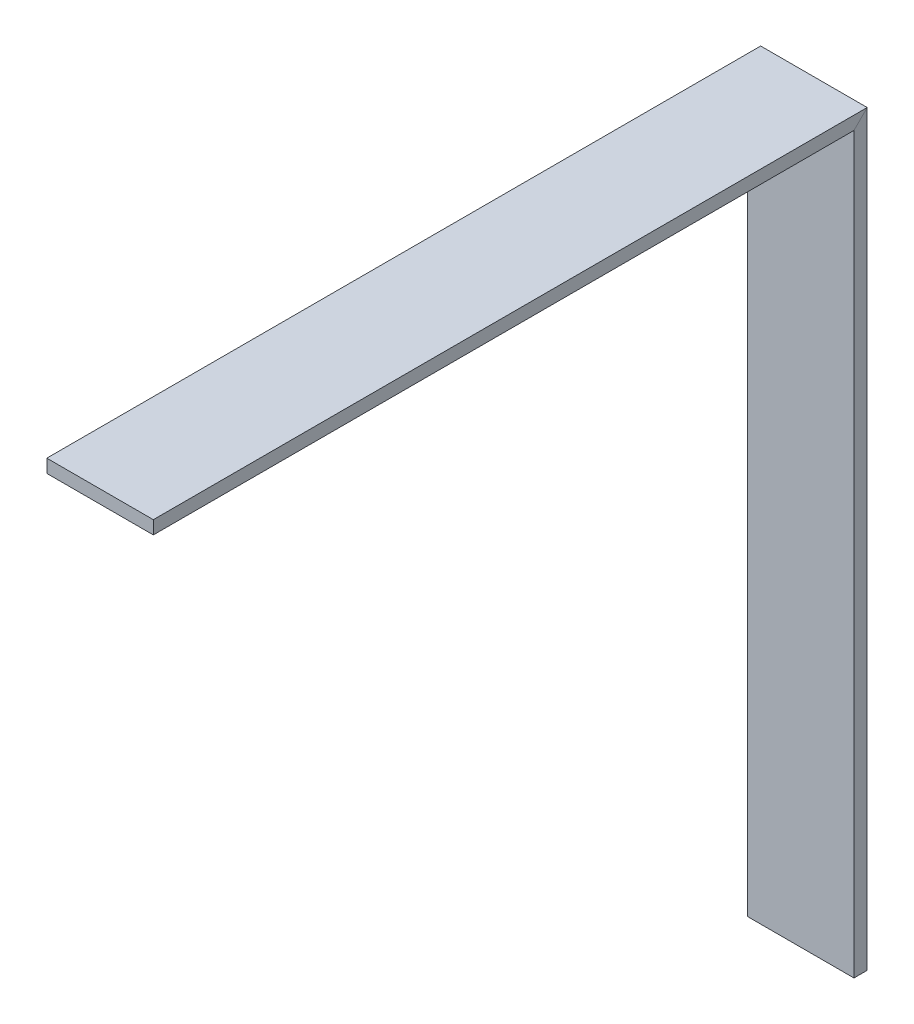
ISO-10303-21;
HEADER;
FILE_DESCRIPTION(('STEP AP214'),'2;1');
FILE_NAME('part.step','',(''),(''),'','','');
FILE_SCHEMA(('AUTOMOTIVE_DESIGN { 1 0 10303 214 1 1 1 1 }'));
ENDSEC;
DATA;
#1=APPLICATION_CONTEXT('core data for automotive mechanical design processes');
#2=APPLICATION_PROTOCOL_DEFINITION('international standard','automotive_design',2000,#1);
#3=PRODUCT_CONTEXT('',#1,'mechanical');
#4=PRODUCT('Part','Part','',(#3));
#5=PRODUCT_RELATED_PRODUCT_CATEGORY('part','',(#4));
#6=PRODUCT_DEFINITION_FORMATION('','',#4);
#7=PRODUCT_DEFINITION_CONTEXT('part definition',#1,'design');
#8=PRODUCT_DEFINITION('design','',#6,#7);
#9=PRODUCT_DEFINITION_SHAPE('','',#8);
#10=(LENGTH_UNIT() NAMED_UNIT(*) SI_UNIT(.MILLI.,.METRE.));
#11=(NAMED_UNIT(*) PLANE_ANGLE_UNIT() SI_UNIT($,.RADIAN.));
#12=(NAMED_UNIT(*) SI_UNIT($,.STERADIAN.) SOLID_ANGLE_UNIT());
#13=UNCERTAINTY_MEASURE_WITH_UNIT(LENGTH_MEASURE(1.E-05),#10,'distance_accuracy_value','');
#14=(GEOMETRIC_REPRESENTATION_CONTEXT(3) GLOBAL_UNCERTAINTY_ASSIGNED_CONTEXT((#13)) GLOBAL_UNIT_ASSIGNED_CONTEXT((#10,
#11,#12)) REPRESENTATION_CONTEXT('',''));
#15=CARTESIAN_POINT('',(0.,0.,0.));
#16=DIRECTION('',(0.,0.,1.));
#17=DIRECTION('',(1.,0.,0.));
#18=AXIS2_PLACEMENT_3D('',#15,#16,#17);
#19=CARTESIAN_POINT('',(25.4,3.155,574.));
#20=DIRECTION('',(-1.,0.,0.));
#21=DIRECTION('',(0.,0.,1.));
#22=AXIS2_PLACEMENT_3D('',#19,#20,#21);
#23=PLANE('',#22);
#24=DIRECTION('',(0.,1.,0.));
#25=VECTOR('',#24,1.);
#26=CARTESIAN_POINT('',(25.4,-278.803420764741,6.3139762721911));
#27=LINE('',#26,#25);
#28=CARTESIAN_POINT('',(25.4,-204.04792076474,6.3139762721911));
#29=VERTEX_POINT('',#28);
#30=CARTESIAN_POINT('',(25.4,145.95207923526,6.31397627219112));
#31=VERTEX_POINT('',#30);
#32=EDGE_CURVE('E86',#29,#31,#27,.T.);
#33=ORIENTED_EDGE('',*,*,#32,.F.);
#34=DIRECTION('',(0.,0.,1.));
#35=VECTOR('',#34,1.);
#36=CARTESIAN_POINT('',(25.4,-204.04792076474,6.31138435162644));
#37=LINE('',#36,#35);
#38=CARTESIAN_POINT('',(25.4,-204.04792076474,0.00397627219100947));
#39=VERTEX_POINT('',#38);
#40=EDGE_CURVE('E49',#39,#29,#37,.T.);
#41=ORIENTED_EDGE('',*,*,#40,.F.);
#42=DIRECTION('',(0.,1.,0.));
#43=VECTOR('',#42,1.);
#44=CARTESIAN_POINT('',(25.4,-278.803420764741,0.0039762721910086));
#45=LINE('',#44,#43);
#46=CARTESIAN_POINT('',(25.4,152.26207923526,0.0039762721910355));
#47=VERTEX_POINT('',#46);
#48=EDGE_CURVE('E104',#39,#47,#45,.T.);
#49=ORIENTED_EDGE('',*,*,#48,.T.);
#50=DIRECTION('',(0.,0.707106781186548,-0.707106781186548));
#51=VECTOR('',#50,1.);
#52=CARTESIAN_POINT('',(25.4,-63.2706707647403,215.536726272191));
#53=LINE('',#52,#51);
#54=EDGE_CURVE('E110',#31,#47,#53,.T.);
#55=ORIENTED_EDGE('',*,*,#54,.F.);
#56=EDGE_LOOP('',(#33,#41,#49,#55));
#57=FACE_BOUND('',#56,.T.);
#58=ADVANCED_FACE('F35',(#57),#23,.F.);
#59=CARTESIAN_POINT('',(-25.4,3.155,574.));
#60=DIRECTION('',(1.,0.,0.));
#61=DIRECTION('',(0.,0.,-1.));
#62=AXIS2_PLACEMENT_3D('',#59,#60,#61);
#63=PLANE('',#62);
#64=DIRECTION('',(0.,1.,0.));
#65=VECTOR('',#64,1.);
#66=CARTESIAN_POINT('',(-25.4,-278.803420764741,0.0039762721910086));
#67=LINE('',#66,#65);
#68=CARTESIAN_POINT('',(-25.4,-204.04792076474,0.00397627219106411));
#69=VERTEX_POINT('',#68);
#70=CARTESIAN_POINT('',(-25.4,152.26207923526,0.0039762721910355));
#71=VERTEX_POINT('',#70);
#72=EDGE_CURVE('E115',#69,#71,#67,.T.);
#73=ORIENTED_EDGE('',*,*,#72,.F.);
#74=DIRECTION('',(0.,0.,1.));
#75=VECTOR('',#74,1.);
#76=CARTESIAN_POINT('',(-25.4,-204.04792076474,574.));
#77=LINE('',#76,#75);
#78=CARTESIAN_POINT('',(-25.4,-204.04792076474,6.31397627219099));
#79=VERTEX_POINT('',#78);
#80=EDGE_CURVE('E98',#69,#79,#77,.T.);
#81=ORIENTED_EDGE('',*,*,#80,.T.);
#82=DIRECTION('',(0.,1.,0.));
#83=VECTOR('',#82,1.);
#84=CARTESIAN_POINT('',(-25.4,-278.803420764741,6.31397627219099));
#85=LINE('',#84,#83);
#86=CARTESIAN_POINT('',(-25.4,145.95207923526,6.31397627219103));
#87=VERTEX_POINT('',#86);
#88=EDGE_CURVE('E57',#79,#87,#85,.T.);
#89=ORIENTED_EDGE('',*,*,#88,.T.);
#90=DIRECTION('',(0.,-0.707106781186548,0.707106781186548));
#91=VECTOR('',#90,1.);
#92=CARTESIAN_POINT('',(-25.4,-63.2706707647403,215.536726272191));
#93=LINE('',#92,#91);
#94=EDGE_CURVE('E141',#71,#87,#93,.T.);
#95=ORIENTED_EDGE('',*,*,#94,.F.);
#96=EDGE_LOOP('',(#73,#81,#89,#95));
#97=FACE_BOUND('',#96,.T.);
#98=ADVANCED_FACE('F143',(#97),#63,.F.);
#99=CARTESIAN_POINT('',(-25.4,-278.803420764741,0.0039762721910086));
#100=DIRECTION('',(0.,0.,1.));
#101=DIRECTION('',(1.,0.,0.));
#102=AXIS2_PLACEMENT_3D('',#99,#100,#101);
#103=PLANE('',#102);
#104=ORIENTED_EDGE('',*,*,#48,.F.);
#105=DIRECTION('',(-1.,0.,0.));
#106=VECTOR('',#105,1.);
#107=CARTESIAN_POINT('',(-25.4,-204.04792076474,0.0039762721910086));
#108=LINE('',#107,#106);
#109=EDGE_CURVE('E96',#39,#69,#108,.T.);
#110=ORIENTED_EDGE('',*,*,#109,.T.);
#111=ORIENTED_EDGE('',*,*,#72,.T.);
#112=DIRECTION('',(-1.,0.,0.));
#113=VECTOR('',#112,1.);
#114=CARTESIAN_POINT('',(-25.4,152.26207923526,0.0039762721910086));
#115=LINE('',#114,#113);
#116=EDGE_CURVE('E109',#47,#71,#115,.T.);
#117=ORIENTED_EDGE('',*,*,#116,.F.);
#118=EDGE_LOOP('',(#104,#110,#111,#117));
#119=FACE_BOUND('',#118,.T.);
#120=ADVANCED_FACE('F107',(#119),#103,.F.);
#121=CARTESIAN_POINT('',(0.,-126.125841529481,340.398976272191));
#122=DIRECTION('',(0.,0.,1.));
#123=DIRECTION('',(-1.,0.,0.));
#124=AXIS2_PLACEMENT_3D('',#121,#122,#123);
#125=PLANE('',#124);
#126=DIRECTION('',(0.,-1.,0.));
#127=VECTOR('',#126,1.);
#128=CARTESIAN_POINT('',(25.4,152.26207923526,340.398976272191));
#129=LINE('',#128,#127);
#130=CARTESIAN_POINT('',(25.4,152.26207923526,340.398976272191));
#131=VERTEX_POINT('',#130);
#132=CARTESIAN_POINT('',(25.4,145.95207923526,340.398976272191));
#133=VERTEX_POINT('',#132);
#134=EDGE_CURVE('E123',#131,#133,#129,.T.);
#135=ORIENTED_EDGE('',*,*,#134,.F.);
#136=DIRECTION('',(1.,0.,0.));
#137=VECTOR('',#136,1.);
#138=CARTESIAN_POINT('',(-25.4,152.26207923526,340.398976272191));
#139=LINE('',#138,#137);
#140=CARTESIAN_POINT('',(-25.4,152.26207923526,340.398976272191));
#141=VERTEX_POINT('',#140);
#142=EDGE_CURVE('E80',#141,#131,#139,.T.);
#143=ORIENTED_EDGE('',*,*,#142,.F.);
#144=DIRECTION('',(0.,1.,0.));
#145=VECTOR('',#144,1.);
#146=CARTESIAN_POINT('',(-25.4,152.26207923526,340.398976272191));
#147=LINE('',#146,#145);
#148=CARTESIAN_POINT('',(-25.4,145.95207923526,340.398976272191));
#149=VERTEX_POINT('',#148);
#150=EDGE_CURVE('E119',#149,#141,#147,.T.);
#151=ORIENTED_EDGE('',*,*,#150,.F.);
#152=DIRECTION('',(-1.,0.,0.));
#153=VECTOR('',#152,1.);
#154=CARTESIAN_POINT('',(-25.4,145.95207923526,340.398976272191));
#155=LINE('',#154,#153);
#156=EDGE_CURVE('E121',#133,#149,#155,.T.);
#157=ORIENTED_EDGE('',*,*,#156,.F.);
#158=EDGE_LOOP('',(#135,#143,#151,#157));
#159=FACE_BOUND('',#158,.T.);
#160=ADVANCED_FACE('F159',(#159),#125,.T.);
#161=CARTESIAN_POINT('',(25.4,152.26207923526,-0.411523727808973));
#162=DIRECTION('',(-1.,0.,0.));
#163=DIRECTION('',(0.,-1.,0.));
#164=AXIS2_PLACEMENT_3D('',#161,#162,#163);
#165=PLANE('',#164);
#166=ORIENTED_EDGE('',*,*,#54,.T.);
#167=DIRECTION('',(0.,0.,1.));
#168=VECTOR('',#167,1.);
#169=CARTESIAN_POINT('',(25.4,152.26207923526,-0.411523727808973));
#170=LINE('',#169,#168);
#171=EDGE_CURVE('E133',#47,#131,#170,.T.);
#172=ORIENTED_EDGE('',*,*,#171,.T.);
#173=ORIENTED_EDGE('',*,*,#134,.T.);
#174=DIRECTION('',(0.,0.,1.));
#175=VECTOR('',#174,1.);
#176=CARTESIAN_POINT('',(25.4,145.95207923526,-0.411523727808972));
#177=LINE('',#176,#175);
#178=EDGE_CURVE('E130',#31,#133,#177,.T.);
#179=ORIENTED_EDGE('',*,*,#178,.F.);
#180=EDGE_LOOP('',(#166,#172,#173,#179));
#181=FACE_BOUND('',#180,.T.);
#182=ADVANCED_FACE('F161',(#181),#165,.F.);
#183=CARTESIAN_POINT('',(-25.4,145.95207923526,-0.411523727808972));
#184=DIRECTION('',(0.,1.,0.));
#185=DIRECTION('',(-1.,0.,0.));
#186=AXIS2_PLACEMENT_3D('',#183,#184,#185);
#187=PLANE('',#186);
#188=DIRECTION('',(1.,0.,0.));
#189=VECTOR('',#188,1.);
#190=CARTESIAN_POINT('',(-25.3999999999991,145.95207923526,6.31397627219099));
#191=LINE('',#190,#189);
#192=EDGE_CURVE('E42',#87,#31,#191,.T.);
#193=ORIENTED_EDGE('',*,*,#192,.T.);
#194=ORIENTED_EDGE('',*,*,#178,.T.);
#195=ORIENTED_EDGE('',*,*,#156,.T.);
#196=DIRECTION('',(0.,0.,1.));
#197=VECTOR('',#196,1.);
#198=CARTESIAN_POINT('',(-25.4,145.95207923526,-0.411523727808972));
#199=LINE('',#198,#197);
#200=EDGE_CURVE('E127',#87,#149,#199,.T.);
#201=ORIENTED_EDGE('',*,*,#200,.F.);
#202=EDGE_LOOP('',(#193,#194,#195,#201));
#203=FACE_BOUND('',#202,.T.);
#204=ADVANCED_FACE('F155',(#203),#187,.F.);
#205=CARTESIAN_POINT('',(-25.4,152.26207923526,-0.411523727808973));
#206=DIRECTION('',(1.,0.,0.));
#207=DIRECTION('',(0.,1.,0.));
#208=AXIS2_PLACEMENT_3D('',#205,#206,#207);
#209=PLANE('',#208);
#210=ORIENTED_EDGE('',*,*,#94,.T.);
#211=ORIENTED_EDGE('',*,*,#200,.T.);
#212=ORIENTED_EDGE('',*,*,#150,.T.);
#213=DIRECTION('',(0.,0.,1.));
#214=VECTOR('',#213,1.);
#215=CARTESIAN_POINT('',(-25.4,152.26207923526,-0.411523727808973));
#216=LINE('',#215,#214);
#217=EDGE_CURVE('E125',#71,#141,#216,.T.);
#218=ORIENTED_EDGE('',*,*,#217,.F.);
#219=EDGE_LOOP('',(#210,#211,#212,#218));
#220=FACE_BOUND('',#219,.T.);
#221=ADVANCED_FACE('F146',(#220),#209,.F.);
#222=CARTESIAN_POINT('',(-25.4,152.26207923526,-0.411523727808973));
#223=DIRECTION('',(0.,-1.,0.));
#224=DIRECTION('',(1.,0.,0.));
#225=AXIS2_PLACEMENT_3D('',#222,#223,#224);
#226=PLANE('',#225);
#227=ORIENTED_EDGE('',*,*,#116,.T.);
#228=ORIENTED_EDGE('',*,*,#217,.T.);
#229=ORIENTED_EDGE('',*,*,#142,.T.);
#230=ORIENTED_EDGE('',*,*,#171,.F.);
#231=EDGE_LOOP('',(#227,#228,#229,#230));
#232=FACE_BOUND('',#231,.T.);
#233=ADVANCED_FACE('F148',(#232),#226,.F.);
#234=CARTESIAN_POINT('',(-25.4,-278.803420764741,6.31397627219099));
#235=DIRECTION('',(0.,0.,-1.));
#236=DIRECTION('',(-1.,0.,0.));
#237=AXIS2_PLACEMENT_3D('',#234,#235,#236);
#238=PLANE('',#237);
#239=ORIENTED_EDGE('',*,*,#88,.F.);
#240=DIRECTION('',(1.,0.,0.));
#241=VECTOR('',#240,1.);
#242=CARTESIAN_POINT('',(-25.4,-204.04792076474,6.31397627219099));
#243=LINE('',#242,#241);
#244=EDGE_CURVE('E11',#79,#29,#243,.T.);
#245=ORIENTED_EDGE('',*,*,#244,.T.);
#246=ORIENTED_EDGE('',*,*,#32,.T.);
#247=ORIENTED_EDGE('',*,*,#192,.F.);
#248=EDGE_LOOP('',(#239,#245,#246,#247));
#249=FACE_BOUND('',#248,.T.);
#250=ADVANCED_FACE('F152',(#249),#238,.F.);
#251=CARTESIAN_POINT('',(-34.6,-204.04792076474,6.31138435162644));
#252=DIRECTION('',(0.,1.,0.));
#253=DIRECTION('',(0.,0.,1.));
#254=AXIS2_PLACEMENT_3D('',#251,#252,#253);
#255=PLANE('',#254);
#256=ORIENTED_EDGE('',*,*,#40,.T.);
#257=ORIENTED_EDGE('',*,*,#244,.F.);
#258=ORIENTED_EDGE('',*,*,#80,.F.);
#259=ORIENTED_EDGE('',*,*,#109,.F.);
#260=EDGE_LOOP('',(#256,#257,#258,#259));
#261=FACE_BOUND('',#260,.T.);
#262=ADVANCED_FACE('F97',(#261),#255,.F.);
#263=CLOSED_SHELL('',(#58,#98,#120,#160,#182,#204,#221,#233,#250,#262));
#264=MANIFOLD_SOLID_BREP('B2',#263);
#265=ADVANCED_BREP_SHAPE_REPRESENTATION('',(#18,#264),#14);
#266=SHAPE_DEFINITION_REPRESENTATION(#9,#265);
ENDSEC;
END-ISO-10303-21;
